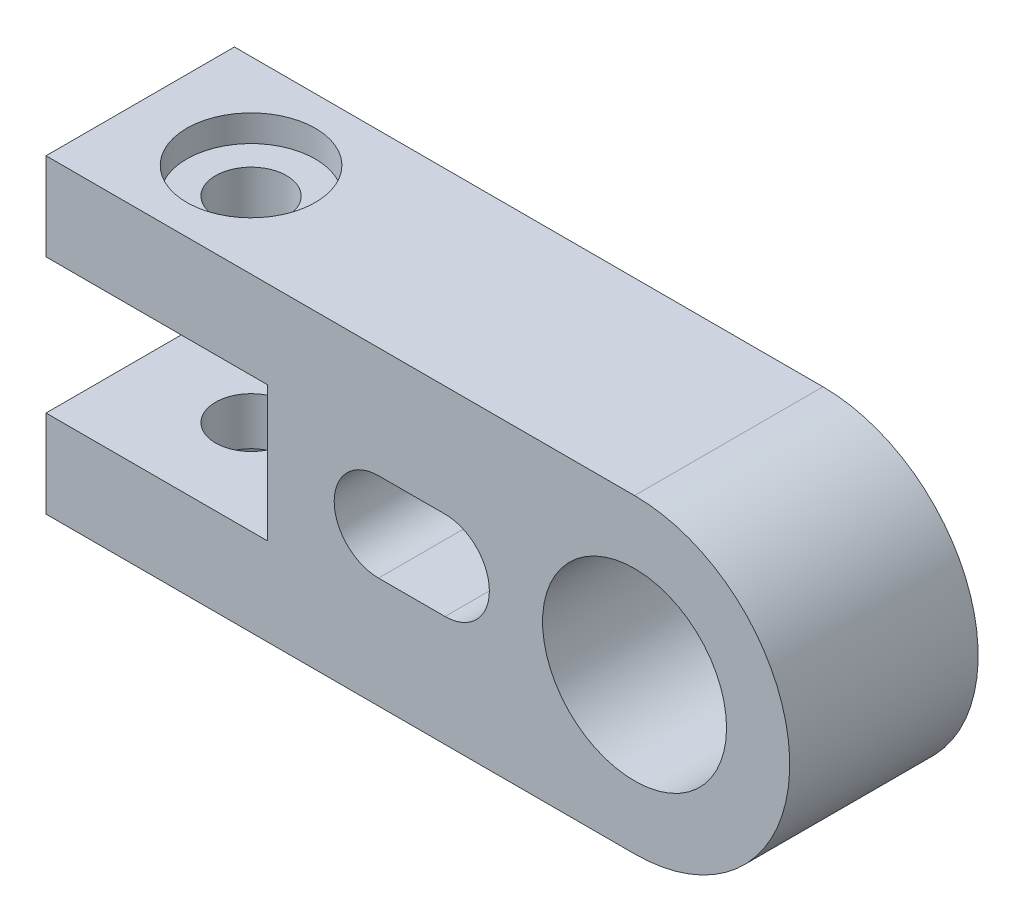
ISO-10303-21;
HEADER;
FILE_DESCRIPTION(('STEP AP214'),'2;1');
FILE_NAME('part.step','',(''),(''),'','','');
FILE_SCHEMA(('AUTOMOTIVE_DESIGN { 1 0 10303 214 1 1 1 1 }'));
ENDSEC;
DATA;
#1=APPLICATION_CONTEXT('core data for automotive mechanical design processes');
#2=APPLICATION_PROTOCOL_DEFINITION('international standard','automotive_design',2000,#1);
#3=PRODUCT_CONTEXT('',#1,'mechanical');
#4=PRODUCT('Part','Part','',(#3));
#5=PRODUCT_RELATED_PRODUCT_CATEGORY('part','',(#4));
#6=PRODUCT_DEFINITION_FORMATION('','',#4);
#7=PRODUCT_DEFINITION_CONTEXT('part definition',#1,'design');
#8=PRODUCT_DEFINITION('design','',#6,#7);
#9=PRODUCT_DEFINITION_SHAPE('','',#8);
#10=(LENGTH_UNIT() NAMED_UNIT(*) SI_UNIT(.MILLI.,.METRE.));
#11=(NAMED_UNIT(*) PLANE_ANGLE_UNIT() SI_UNIT($,.RADIAN.));
#12=(NAMED_UNIT(*) SI_UNIT($,.STERADIAN.) SOLID_ANGLE_UNIT());
#13=UNCERTAINTY_MEASURE_WITH_UNIT(LENGTH_MEASURE(1.E-05),#10,'distance_accuracy_value','');
#14=(GEOMETRIC_REPRESENTATION_CONTEXT(3) GLOBAL_UNCERTAINTY_ASSIGNED_CONTEXT((#13)) GLOBAL_UNIT_ASSIGNED_CONTEXT((#10,
#11,#12)) REPRESENTATION_CONTEXT('',''));
#15=CARTESIAN_POINT('',(0.,0.,0.));
#16=DIRECTION('',(0.,0.,1.));
#17=DIRECTION('',(1.,0.,0.));
#18=AXIS2_PLACEMENT_3D('',#15,#16,#17);
#19=CARTESIAN_POINT('',(0.,-5.2,0.));
#20=DIRECTION('',(0.,-1.,0.));
#21=DIRECTION('',(0.,0.,-1.));
#22=AXIS2_PLACEMENT_3D('',#19,#20,#21);
#23=PLANE('',#22);
#24=CARTESIAN_POINT('',(-21.55,-5.2,4.25));
#25=DIRECTION('',(0.,-1.,0.));
#26=DIRECTION('',(1.,0.,0.));
#27=AXIS2_PLACEMENT_3D('',#24,#25,#26);
#28=CIRCLE('',#27,1.6);
#29=CARTESIAN_POINT('',(-19.95,-5.2,4.25));
#30=VERTEX_POINT('',#29);
#31=EDGE_CURVE('E19',#30,#30,#28,.F.);
#32=ORIENTED_EDGE('',*,*,#31,.T.);
#33=EDGE_LOOP('',(#32));
#34=FACE_BOUND('',#33,.T.);
#35=DIRECTION('',(-0.5,0.,0.866025403784439));
#36=VECTOR('',#35,1.);
#37=CARTESIAN_POINT('',(-24.8986315612998,-5.2,4.25));
#38=LINE('',#37,#36);
#39=CARTESIAN_POINT('',(-24.8986315612998,-5.2,4.25));
#40=VERTEX_POINT('',#39);
#41=CARTESIAN_POINT('',(-23.2243157806499,-5.2,1.35));
#42=VERTEX_POINT('',#41);
#43=EDGE_CURVE('E212',#40,#42,#38,.F.);
#44=ORIENTED_EDGE('',*,*,#43,.T.);
#45=DIRECTION('',(-1.,0.,0.));
#46=VECTOR('',#45,1.);
#47=CARTESIAN_POINT('',(-23.2243157806499,-5.2,1.35));
#48=LINE('',#47,#46);
#49=CARTESIAN_POINT('',(-19.8756842193501,-5.2,1.35));
#50=VERTEX_POINT('',#49);
#51=EDGE_CURVE('E207',#42,#50,#48,.F.);
#52=ORIENTED_EDGE('',*,*,#51,.T.);
#53=DIRECTION('',(-0.5,0.,-0.866025403784439));
#54=VECTOR('',#53,1.);
#55=CARTESIAN_POINT('',(-19.8756842193501,-5.2,1.35));
#56=LINE('',#55,#54);
#57=CARTESIAN_POINT('',(-18.2013684387002,-5.2,4.25));
#58=VERTEX_POINT('',#57);
#59=EDGE_CURVE('E202',#50,#58,#56,.F.);
#60=ORIENTED_EDGE('',*,*,#59,.T.);
#61=DIRECTION('',(0.5,0.,-0.866025403784439));
#62=VECTOR('',#61,1.);
#63=CARTESIAN_POINT('',(-18.2013684387002,-5.2,4.25));
#64=LINE('',#63,#62);
#65=CARTESIAN_POINT('',(-19.8756842193501,-5.2,7.15));
#66=VERTEX_POINT('',#65);
#67=EDGE_CURVE('E197',#58,#66,#64,.F.);
#68=ORIENTED_EDGE('',*,*,#67,.T.);
#69=DIRECTION('',(1.,0.,0.));
#70=VECTOR('',#69,1.);
#71=CARTESIAN_POINT('',(-19.8756842193501,-5.2,7.15));
#72=LINE('',#71,#70);
#73=CARTESIAN_POINT('',(-23.2243157806499,-5.2,7.15));
#74=VERTEX_POINT('',#73);
#75=EDGE_CURVE('E222',#66,#74,#72,.F.);
#76=ORIENTED_EDGE('',*,*,#75,.T.);
#77=DIRECTION('',(0.5,0.,0.866025403784439));
#78=VECTOR('',#77,1.);
#79=CARTESIAN_POINT('',(-23.2243157806499,-5.2,7.15));
#80=LINE('',#79,#78);
#81=EDGE_CURVE('E217',#74,#40,#80,.F.);
#82=ORIENTED_EDGE('',*,*,#81,.T.);
#83=EDGE_LOOP('',(#44,#52,#60,#68,#76,#82));
#84=FACE_BOUND('',#83,.T.);
#85=ADVANCED_FACE('F16',(#34,#84),#23,.T.);
#86=CARTESIAN_POINT('',(-21.55,5.8,4.25));
#87=DIRECTION('',(0.,1.,0.));
#88=DIRECTION('',(-1.,0.,0.));
#89=AXIS2_PLACEMENT_3D('',#86,#87,#88);
#90=PLANE('',#89);
#91=CARTESIAN_POINT('',(-21.55,5.8,4.25));
#92=DIRECTION('',(0.,-1.,0.));
#93=DIRECTION('',(1.,0.,0.));
#94=AXIS2_PLACEMENT_3D('',#91,#92,#93);
#95=CIRCLE('',#94,1.6);
#96=CARTESIAN_POINT('',(-19.95,5.8,4.25));
#97=VERTEX_POINT('',#96);
#98=EDGE_CURVE('E258',#97,#97,#95,.T.);
#99=ORIENTED_EDGE('',*,*,#98,.T.);
#100=EDGE_LOOP('',(#99));
#101=FACE_BOUND('',#100,.T.);
#102=CARTESIAN_POINT('',(-21.55,5.8,4.25));
#103=DIRECTION('',(0.,1.,0.));
#104=DIRECTION('',(-1.,0.,0.));
#105=AXIS2_PLACEMENT_3D('',#102,#103,#104);
#106=CIRCLE('',#105,2.9);
#107=CARTESIAN_POINT('',(-24.45,5.8,4.25));
#108=VERTEX_POINT('',#107);
#109=EDGE_CURVE('E256',#108,#108,#106,.T.);
#110=ORIENTED_EDGE('',*,*,#109,.T.);
#111=EDGE_LOOP('',(#110));
#112=FACE_BOUND('',#111,.T.);
#113=ADVANCED_FACE('F355',(#101,#112),#90,.T.);
#114=CARTESIAN_POINT('',(0.,0.,1.7));
#115=DIRECTION('',(0.,0.,1.));
#116=DIRECTION('',(1.,0.,0.));
#117=AXIS2_PLACEMENT_3D('',#114,#115,#116);
#118=CYLINDRICAL_SURFACE('',#117,4.15);
#119=CARTESIAN_POINT('',(0.,0.,8.5));
#120=DIRECTION('',(0.,0.,1.));
#121=DIRECTION('',(1.,0.,0.));
#122=AXIS2_PLACEMENT_3D('',#119,#120,#121);
#123=CIRCLE('',#122,4.15);
#124=CARTESIAN_POINT('',(4.15,0.,8.5));
#125=VERTEX_POINT('',#124);
#126=EDGE_CURVE('E253',#125,#125,#123,.T.);
#127=ORIENTED_EDGE('',*,*,#126,.T.);
#128=EDGE_LOOP('',(#127));
#129=FACE_BOUND('',#128,.T.);
#130=CARTESIAN_POINT('',(0.,0.,1.7));
#131=DIRECTION('',(0.,0.,1.));
#132=DIRECTION('',(1.,0.,0.));
#133=AXIS2_PLACEMENT_3D('',#130,#131,#132);
#134=CIRCLE('',#133,4.15);
#135=CARTESIAN_POINT('',(4.15,0.,1.7));
#136=VERTEX_POINT('',#135);
#137=EDGE_CURVE('E145',#136,#136,#134,.T.);
#138=ORIENTED_EDGE('',*,*,#137,.F.);
#139=EDGE_LOOP('',(#138));
#140=FACE_BOUND('',#139,.T.);
#141=ADVANCED_FACE('F357',(#129,#140),#118,.F.);
#142=CARTESIAN_POINT('',(-19.8756842193501,-5.2,7.15));
#143=DIRECTION('',(0.,0.,1.));
#144=DIRECTION('',(1.,0.,0.));
#145=AXIS2_PLACEMENT_3D('',#142,#143,#144);
#146=PLANE('',#145);
#147=DIRECTION('',(0.,1.,0.));
#148=VECTOR('',#147,1.);
#149=CARTESIAN_POINT('',(-23.2243157806499,-5.2,7.15));
#150=LINE('',#149,#148);
#151=CARTESIAN_POINT('',(-23.2243157806499,-7.,7.15));
#152=VERTEX_POINT('',#151);
#153=EDGE_CURVE('E219',#152,#74,#150,.T.);
#154=ORIENTED_EDGE('',*,*,#153,.T.);
#155=ORIENTED_EDGE('',*,*,#75,.F.);
#156=DIRECTION('',(0.,1.,0.));
#157=VECTOR('',#156,1.);
#158=CARTESIAN_POINT('',(-19.8756842193501,-5.2,7.15));
#159=LINE('',#158,#157);
#160=CARTESIAN_POINT('',(-19.8756842193501,-7.,7.15));
#161=VERTEX_POINT('',#160);
#162=EDGE_CURVE('E194',#66,#161,#159,.F.);
#163=ORIENTED_EDGE('',*,*,#162,.T.);
#164=DIRECTION('',(-1.,0.,0.));
#165=VECTOR('',#164,1.);
#166=CARTESIAN_POINT('',(0.,-7.,7.15));
#167=LINE('',#166,#165);
#168=EDGE_CURVE('E249',#161,#152,#167,.T.);
#169=ORIENTED_EDGE('',*,*,#168,.T.);
#170=EDGE_LOOP('',(#154,#155,#163,#169));
#171=FACE_BOUND('',#170,.T.);
#172=ADVANCED_FACE('F362',(#171),#146,.F.);
#173=CARTESIAN_POINT('',(-23.2243157806499,-5.2,7.15));
#174=DIRECTION('',(-0.866025403784439,0.,0.5));
#175=DIRECTION('',(0.5,0.,0.866025403784439));
#176=AXIS2_PLACEMENT_3D('',#173,#174,#175);
#177=PLANE('',#176);
#178=DIRECTION('',(0.,1.,0.));
#179=VECTOR('',#178,1.);
#180=CARTESIAN_POINT('',(-24.8986315612998,-5.2,4.25));
#181=LINE('',#180,#179);
#182=CARTESIAN_POINT('',(-24.8986315612998,-7.,4.25));
#183=VERTEX_POINT('',#182);
#184=EDGE_CURVE('E214',#183,#40,#181,.T.);
#185=ORIENTED_EDGE('',*,*,#184,.T.);
#186=ORIENTED_EDGE('',*,*,#81,.F.);
#187=ORIENTED_EDGE('',*,*,#153,.F.);
#188=DIRECTION('',(-0.5,0.,-0.866025403784439));
#189=VECTOR('',#188,1.);
#190=CARTESIAN_POINT('',(-23.2243157806499,-7.,7.15));
#191=LINE('',#190,#189);
#192=EDGE_CURVE('E422',#152,#183,#191,.T.);
#193=ORIENTED_EDGE('',*,*,#192,.T.);
#194=EDGE_LOOP('',(#185,#186,#187,#193));
#195=FACE_BOUND('',#194,.T.);
#196=ADVANCED_FACE('F368',(#195),#177,.F.);
#197=CARTESIAN_POINT('',(-24.8986315612998,-5.2,4.25));
#198=DIRECTION('',(-0.866025403784439,0.,-0.5));
#199=DIRECTION('',(-0.5,0.,0.866025403784439));
#200=AXIS2_PLACEMENT_3D('',#197,#198,#199);
#201=PLANE('',#200);
#202=DIRECTION('',(0.,1.,0.));
#203=VECTOR('',#202,1.);
#204=CARTESIAN_POINT('',(-23.2243157806499,-5.2,1.35));
#205=LINE('',#204,#203);
#206=CARTESIAN_POINT('',(-23.2243157806499,-7.,1.35));
#207=VERTEX_POINT('',#206);
#208=EDGE_CURVE('E209',#207,#42,#205,.T.);
#209=ORIENTED_EDGE('',*,*,#208,.T.);
#210=ORIENTED_EDGE('',*,*,#43,.F.);
#211=ORIENTED_EDGE('',*,*,#184,.F.);
#212=DIRECTION('',(0.5,0.,-0.866025403784439));
#213=VECTOR('',#212,1.);
#214=CARTESIAN_POINT('',(-24.8986315612998,-7.,4.25));
#215=LINE('',#214,#213);
#216=EDGE_CURVE('E409',#183,#207,#215,.T.);
#217=ORIENTED_EDGE('',*,*,#216,.T.);
#218=EDGE_LOOP('',(#209,#210,#211,#217));
#219=FACE_BOUND('',#218,.T.);
#220=ADVANCED_FACE('F372',(#219),#201,.F.);
#221=CARTESIAN_POINT('',(-23.2243157806499,-5.2,1.35));
#222=DIRECTION('',(0.,0.,-1.));
#223=DIRECTION('',(-1.,0.,0.));
#224=AXIS2_PLACEMENT_3D('',#221,#222,#223);
#225=PLANE('',#224);
#226=DIRECTION('',(0.,1.,0.));
#227=VECTOR('',#226,1.);
#228=CARTESIAN_POINT('',(-19.8756842193501,-5.2,1.35));
#229=LINE('',#228,#227);
#230=CARTESIAN_POINT('',(-19.8756842193501,-7.,1.35));
#231=VERTEX_POINT('',#230);
#232=EDGE_CURVE('E204',#231,#50,#229,.T.);
#233=ORIENTED_EDGE('',*,*,#232,.T.);
#234=ORIENTED_EDGE('',*,*,#51,.F.);
#235=ORIENTED_EDGE('',*,*,#208,.F.);
#236=DIRECTION('',(-1.,0.,0.));
#237=VECTOR('',#236,1.);
#238=CARTESIAN_POINT('',(0.,-7.,1.35));
#239=LINE('',#238,#237);
#240=EDGE_CURVE('E413',#207,#231,#239,.F.);
#241=ORIENTED_EDGE('',*,*,#240,.T.);
#242=EDGE_LOOP('',(#233,#234,#235,#241));
#243=FACE_BOUND('',#242,.T.);
#244=ADVANCED_FACE('F376',(#243),#225,.F.);
#245=CARTESIAN_POINT('',(-19.8756842193501,-5.2,1.35));
#246=DIRECTION('',(0.866025403784439,0.,-0.5));
#247=DIRECTION('',(-0.5,0.,-0.866025403784439));
#248=AXIS2_PLACEMENT_3D('',#245,#246,#247);
#249=PLANE('',#248);
#250=DIRECTION('',(0.,1.,0.));
#251=VECTOR('',#250,1.);
#252=CARTESIAN_POINT('',(-18.2013684387002,-5.2,4.25000000000001));
#253=LINE('',#252,#251);
#254=CARTESIAN_POINT('',(-18.2013684387002,-7.,4.25));
#255=VERTEX_POINT('',#254);
#256=EDGE_CURVE('E199',#255,#58,#253,.T.);
#257=ORIENTED_EDGE('',*,*,#256,.T.);
#258=ORIENTED_EDGE('',*,*,#59,.F.);
#259=ORIENTED_EDGE('',*,*,#232,.F.);
#260=DIRECTION('',(0.499999999999999,0.,0.866025403784439));
#261=VECTOR('',#260,1.);
#262=CARTESIAN_POINT('',(-19.8756842193501,-7.,1.35));
#263=LINE('',#262,#261);
#264=EDGE_CURVE('E391',#231,#255,#263,.T.);
#265=ORIENTED_EDGE('',*,*,#264,.T.);
#266=EDGE_LOOP('',(#257,#258,#259,#265));
#267=FACE_BOUND('',#266,.T.);
#268=ADVANCED_FACE('F281',(#267),#249,.F.);
#269=CARTESIAN_POINT('',(-18.2013684387002,-5.2,4.25));
#270=DIRECTION('',(0.866025403784439,0.,0.5));
#271=DIRECTION('',(0.5,0.,-0.866025403784439));
#272=AXIS2_PLACEMENT_3D('',#269,#270,#271);
#273=PLANE('',#272);
#274=ORIENTED_EDGE('',*,*,#162,.F.);
#275=ORIENTED_EDGE('',*,*,#67,.F.);
#276=ORIENTED_EDGE('',*,*,#256,.F.);
#277=DIRECTION('',(-0.499999999999999,0.,0.866025403784439));
#278=VECTOR('',#277,1.);
#279=CARTESIAN_POINT('',(-18.2013684387002,-7.,4.25));
#280=LINE('',#279,#278);
#281=EDGE_CURVE('E191',#255,#161,#280,.T.);
#282=ORIENTED_EDGE('',*,*,#281,.T.);
#283=EDGE_LOOP('',(#274,#275,#276,#282));
#284=FACE_BOUND('',#283,.T.);
#285=ADVANCED_FACE('F270',(#284),#273,.F.);
#286=CARTESIAN_POINT('',(-21.55,11.5254833995939,4.25));
#287=DIRECTION('',(0.,-1.,0.));
#288=DIRECTION('',(1.,0.,0.));
#289=AXIS2_PLACEMENT_3D('',#286,#287,#288);
#290=CYLINDRICAL_SURFACE('',#289,1.6);
#291=CARTESIAN_POINT('',(-21.55,-3.05,4.25));
#292=DIRECTION('',(0.,-1.,0.));
#293=DIRECTION('',(1.,0.,0.));
#294=AXIS2_PLACEMENT_3D('',#291,#292,#293);
#295=CIRCLE('',#294,1.6);
#296=CARTESIAN_POINT('',(-19.95,-3.05,4.25));
#297=VERTEX_POINT('',#296);
#298=EDGE_CURVE('E180',#297,#297,#295,.F.);
#299=ORIENTED_EDGE('',*,*,#298,.T.);
#300=EDGE_LOOP('',(#299));
#301=FACE_BOUND('',#300,.T.);
#302=ORIENTED_EDGE('',*,*,#31,.F.);
#303=EDGE_LOOP('',(#302));
#304=FACE_BOUND('',#303,.T.);
#305=ADVANCED_FACE('F267',(#301,#304),#290,.F.);
#306=CARTESIAN_POINT('',(-21.55,11.5254833995939,4.25));
#307=DIRECTION('',(0.,-1.,0.));
#308=DIRECTION('',(1.,0.,0.));
#309=AXIS2_PLACEMENT_3D('',#306,#307,#308);
#310=CYLINDRICAL_SURFACE('',#309,1.6);
#311=CARTESIAN_POINT('',(-21.55,3.05,4.25));
#312=DIRECTION('',(0.,-1.,0.));
#313=DIRECTION('',(1.,0.,0.));
#314=AXIS2_PLACEMENT_3D('',#311,#312,#313);
#315=CIRCLE('',#314,1.6);
#316=CARTESIAN_POINT('',(-19.95,3.05,4.25));
#317=VERTEX_POINT('',#316);
#318=EDGE_CURVE('E169',#317,#317,#315,.T.);
#319=ORIENTED_EDGE('',*,*,#318,.T.);
#320=EDGE_LOOP('',(#319));
#321=FACE_BOUND('',#320,.T.);
#322=ORIENTED_EDGE('',*,*,#98,.F.);
#323=EDGE_LOOP('',(#322));
#324=FACE_BOUND('',#323,.T.);
#325=ADVANCED_FACE('F269',(#321,#324),#310,.F.);
#326=CARTESIAN_POINT('',(-21.55,5.8,4.25));
#327=DIRECTION('',(0.,1.,0.));
#328=DIRECTION('',(-1.,0.,0.));
#329=AXIS2_PLACEMENT_3D('',#326,#327,#328);
#330=CYLINDRICAL_SURFACE('',#329,2.9);
#331=ORIENTED_EDGE('',*,*,#109,.F.);
#332=EDGE_LOOP('',(#331));
#333=FACE_BOUND('',#332,.T.);
#334=CARTESIAN_POINT('',(-21.55,7.,4.25));
#335=DIRECTION('',(0.,1.,0.));
#336=DIRECTION('',(-1.,0.,0.));
#337=AXIS2_PLACEMENT_3D('',#334,#335,#336);
#338=CIRCLE('',#337,2.9);
#339=CARTESIAN_POINT('',(-24.45,7.,4.25));
#340=VERTEX_POINT('',#339);
#341=EDGE_CURVE('E240',#340,#340,#338,.T.);
#342=ORIENTED_EDGE('',*,*,#341,.T.);
#343=EDGE_LOOP('',(#342));
#344=FACE_BOUND('',#343,.T.);
#345=ADVANCED_FACE('F278',(#333,#344),#330,.F.);
#346=CARTESIAN_POINT('',(0.,0.,8.5));
#347=DIRECTION('',(0.,0.,-1.));
#348=DIRECTION('',(-1.,0.,0.));
#349=AXIS2_PLACEMENT_3D('',#346,#347,#348);
#350=PLANE('',#349);
#351=DIRECTION('',(1.,0.,0.));
#352=VECTOR('',#351,1.);
#353=CARTESIAN_POINT('',(0.,7.,8.5));
#354=LINE('',#353,#352);
#355=CARTESIAN_POINT('',(0.,7.,8.5));
#356=VERTEX_POINT('',#355);
#357=CARTESIAN_POINT('',(-26.55,7.,8.5));
#358=VERTEX_POINT('',#357);
#359=EDGE_CURVE('E162',#356,#358,#354,.F.);
#360=ORIENTED_EDGE('',*,*,#359,.T.);
#361=DIRECTION('',(0.,1.,0.));
#362=VECTOR('',#361,1.);
#363=CARTESIAN_POINT('',(-26.55,7.,8.5));
#364=LINE('',#363,#362);
#365=CARTESIAN_POINT('',(-26.55,3.05,8.5));
#366=VERTEX_POINT('',#365);
#367=EDGE_CURVE('E156',#358,#366,#364,.F.);
#368=ORIENTED_EDGE('',*,*,#367,.T.);
#369=DIRECTION('',(1.,0.,0.));
#370=VECTOR('',#369,1.);
#371=CARTESIAN_POINT('',(-26.55,3.05,8.5));
#372=LINE('',#371,#370);
#373=CARTESIAN_POINT('',(-16.55,3.05,8.5));
#374=VERTEX_POINT('',#373);
#375=EDGE_CURVE('E167',#366,#374,#372,.T.);
#376=ORIENTED_EDGE('',*,*,#375,.T.);
#377=DIRECTION('',(0.,1.,0.));
#378=VECTOR('',#377,1.);
#379=CARTESIAN_POINT('',(-16.55,3.05,8.5));
#380=LINE('',#379,#378);
#381=CARTESIAN_POINT('',(-16.55,-3.05,8.5));
#382=VERTEX_POINT('',#381);
#383=EDGE_CURVE('E172',#374,#382,#380,.F.);
#384=ORIENTED_EDGE('',*,*,#383,.T.);
#385=DIRECTION('',(1.,0.,0.));
#386=VECTOR('',#385,1.);
#387=CARTESIAN_POINT('',(-16.55,-3.05,8.5));
#388=LINE('',#387,#386);
#389=CARTESIAN_POINT('',(-26.55,-3.05,8.5));
#390=VERTEX_POINT('',#389);
#391=EDGE_CURVE('E178',#382,#390,#388,.F.);
#392=ORIENTED_EDGE('',*,*,#391,.T.);
#393=DIRECTION('',(0.,1.,0.));
#394=VECTOR('',#393,1.);
#395=CARTESIAN_POINT('',(-26.55,-3.05,8.5));
#396=LINE('',#395,#394);
#397=CARTESIAN_POINT('',(-26.55,-7.,8.5));
#398=VERTEX_POINT('',#397);
#399=EDGE_CURVE('E183',#390,#398,#396,.F.);
#400=ORIENTED_EDGE('',*,*,#399,.T.);
#401=DIRECTION('',(-1.,0.,0.));
#402=VECTOR('',#401,1.);
#403=CARTESIAN_POINT('',(0.,-7.,8.5));
#404=LINE('',#403,#402);
#405=CARTESIAN_POINT('',(0.,-7.,8.5));
#406=VERTEX_POINT('',#405);
#407=EDGE_CURVE('E189',#398,#406,#404,.F.);
#408=ORIENTED_EDGE('',*,*,#407,.T.);
#409=CARTESIAN_POINT('',(0.,0.,8.5));
#410=DIRECTION('',(0.,0.,-1.));
#411=DIRECTION('',(-1.,0.,0.));
#412=AXIS2_PLACEMENT_3D('',#409,#410,#411);
#413=CIRCLE('',#412,7.);
#414=EDGE_CURVE('E247',#356,#406,#413,.T.);
#415=ORIENTED_EDGE('',*,*,#414,.F.);
#416=EDGE_LOOP('',(#360,#368,#376,#384,#392,#400,#408,#415));
#417=FACE_BOUND('',#416,.T.);
#418=ORIENTED_EDGE('',*,*,#126,.F.);
#419=EDGE_LOOP('',(#418));
#420=FACE_BOUND('',#419,.T.);
#421=CARTESIAN_POINT('',(-8.55,0.,8.5));
#422=DIRECTION('',(0.,0.,1.));
#423=DIRECTION('',(1.,0.,0.));
#424=AXIS2_PLACEMENT_3D('',#421,#422,#423);
#425=CIRCLE('',#424,2.);
#426=CARTESIAN_POINT('',(-8.55,2.,8.5));
#427=VERTEX_POINT('',#426);
#428=CARTESIAN_POINT('',(-8.55,-2.,8.5));
#429=VERTEX_POINT('',#428);
#430=EDGE_CURVE('E129',#427,#429,#425,.F.);
#431=ORIENTED_EDGE('',*,*,#430,.T.);
#432=DIRECTION('',(1.,0.,0.));
#433=VECTOR('',#432,1.);
#434=CARTESIAN_POINT('',(-8.55,-2.,8.5));
#435=LINE('',#434,#433);
#436=CARTESIAN_POINT('',(-11.55,-2.,8.5));
#437=VERTEX_POINT('',#436);
#438=EDGE_CURVE('E224',#429,#437,#435,.F.);
#439=ORIENTED_EDGE('',*,*,#438,.T.);
#440=CARTESIAN_POINT('',(-11.55,0.,8.5));
#441=DIRECTION('',(0.,0.,1.));
#442=DIRECTION('',(1.,0.,0.));
#443=AXIS2_PLACEMENT_3D('',#440,#441,#442);
#444=CIRCLE('',#443,2.);
#445=CARTESIAN_POINT('',(-11.55,2.,8.5));
#446=VERTEX_POINT('',#445);
#447=EDGE_CURVE('E132',#437,#446,#444,.F.);
#448=ORIENTED_EDGE('',*,*,#447,.T.);
#449=DIRECTION('',(-1.,0.,0.));
#450=VECTOR('',#449,1.);
#451=CARTESIAN_POINT('',(-8.55,2.,8.5));
#452=LINE('',#451,#450);
#453=EDGE_CURVE('E126',#446,#427,#452,.F.);
#454=ORIENTED_EDGE('',*,*,#453,.T.);
#455=EDGE_LOOP('',(#431,#439,#448,#454));
#456=FACE_BOUND('',#455,.T.);
#457=ADVANCED_FACE('F128',(#417,#420,#456),#350,.F.);
#458=CARTESIAN_POINT('',(0.,0.,1.7));
#459=DIRECTION('',(0.,0.,1.));
#460=DIRECTION('',(1.,0.,0.));
#461=AXIS2_PLACEMENT_3D('',#458,#459,#460);
#462=PLANE('',#461);
#463=ORIENTED_EDGE('',*,*,#137,.T.);
#464=EDGE_LOOP('',(#463));
#465=FACE_BOUND('',#464,.T.);
#466=CARTESIAN_POINT('',(0.,0.,1.7));
#467=DIRECTION('',(0.,0.,-1.));
#468=DIRECTION('',(-1.,0.,0.));
#469=AXIS2_PLACEMENT_3D('',#466,#467,#468);
#470=CIRCLE('',#469,2.85);
#471=CARTESIAN_POINT('',(-2.85,0.,1.7));
#472=VERTEX_POINT('',#471);
#473=EDGE_CURVE('E237',#472,#472,#470,.T.);
#474=ORIENTED_EDGE('',*,*,#473,.T.);
#475=EDGE_LOOP('',(#474));
#476=FACE_BOUND('',#475,.T.);
#477=ADVANCED_FACE('F339',(#465,#476),#462,.T.);
#478=CARTESIAN_POINT('',(-8.55,0.,-0.000999999999999265));
#479=DIRECTION('',(0.,0.,1.));
#480=DIRECTION('',(1.,0.,0.));
#481=AXIS2_PLACEMENT_3D('',#478,#479,#480);
#482=CYLINDRICAL_SURFACE('',#481,2.);
#483=DIRECTION('',(0.,0.,1.));
#484=VECTOR('',#483,1.);
#485=CARTESIAN_POINT('',(-8.55,2.,-0.000999999999999265));
#486=LINE('',#485,#484);
#487=CARTESIAN_POINT('',(-8.55,2.,0.));
#488=VERTEX_POINT('',#487);
#489=EDGE_CURVE('E136',#427,#488,#486,.F.);
#490=ORIENTED_EDGE('',*,*,#489,.T.);
#491=CARTESIAN_POINT('',(-8.55,0.,0.));
#492=DIRECTION('',(0.,0.,1.));
#493=DIRECTION('',(1.,0.,0.));
#494=AXIS2_PLACEMENT_3D('',#491,#492,#493);
#495=CIRCLE('',#494,2.);
#496=CARTESIAN_POINT('',(-8.55,-2.,0.));
#497=VERTEX_POINT('',#496);
#498=EDGE_CURVE('E235',#497,#488,#495,.T.);
#499=ORIENTED_EDGE('',*,*,#498,.F.);
#500=DIRECTION('',(0.,0.,1.));
#501=VECTOR('',#500,1.);
#502=CARTESIAN_POINT('',(-8.55,-2.,-0.000999999999999265));
#503=LINE('',#502,#501);
#504=EDGE_CURVE('E143',#497,#429,#503,.T.);
#505=ORIENTED_EDGE('',*,*,#504,.T.);
#506=ORIENTED_EDGE('',*,*,#430,.F.);
#507=EDGE_LOOP('',(#490,#499,#505,#506));
#508=FACE_BOUND('',#507,.T.);
#509=ADVANCED_FACE('F140',(#508),#482,.F.);
#510=CARTESIAN_POINT('',(-8.55,2.,-0.000999999999999265));
#511=DIRECTION('',(0.,1.,0.));
#512=DIRECTION('',(-1.,0.,0.));
#513=AXIS2_PLACEMENT_3D('',#510,#511,#512);
#514=PLANE('',#513);
#515=ORIENTED_EDGE('',*,*,#453,.F.);
#516=DIRECTION('',(0.,0.,1.));
#517=VECTOR('',#516,1.);
#518=CARTESIAN_POINT('',(-11.55,2.,-0.000999999999999265));
#519=LINE('',#518,#517);
#520=CARTESIAN_POINT('',(-11.55,2.,0.));
#521=VERTEX_POINT('',#520);
#522=EDGE_CURVE('E151',#446,#521,#519,.F.);
#523=ORIENTED_EDGE('',*,*,#522,.T.);
#524=DIRECTION('',(-1.,0.,0.));
#525=VECTOR('',#524,1.);
#526=CARTESIAN_POINT('',(0.,2.,0.));
#527=LINE('',#526,#525);
#528=EDGE_CURVE('E149',#488,#521,#527,.T.);
#529=ORIENTED_EDGE('',*,*,#528,.F.);
#530=ORIENTED_EDGE('',*,*,#489,.F.);
#531=EDGE_LOOP('',(#515,#523,#529,#530));
#532=FACE_BOUND('',#531,.T.);
#533=ADVANCED_FACE('F147',(#532),#514,.F.);
#534=CARTESIAN_POINT('',(-11.55,0.,-0.000999999999999265));
#535=DIRECTION('',(0.,0.,1.));
#536=DIRECTION('',(1.,0.,0.));
#537=AXIS2_PLACEMENT_3D('',#534,#535,#536);
#538=CYLINDRICAL_SURFACE('',#537,2.);
#539=ORIENTED_EDGE('',*,*,#447,.F.);
#540=DIRECTION('',(0.,0.,1.));
#541=VECTOR('',#540,1.);
#542=CARTESIAN_POINT('',(-11.55,-2.,-0.000999999999999265));
#543=LINE('',#542,#541);
#544=CARTESIAN_POINT('',(-11.55,-2.,0.));
#545=VERTEX_POINT('',#544);
#546=EDGE_CURVE('E225',#437,#545,#543,.F.);
#547=ORIENTED_EDGE('',*,*,#546,.T.);
#548=CARTESIAN_POINT('',(-11.55,0.,0.));
#549=DIRECTION('',(0.,0.,1.));
#550=DIRECTION('',(1.,0.,0.));
#551=AXIS2_PLACEMENT_3D('',#548,#549,#550);
#552=CIRCLE('',#551,2.);
#553=EDGE_CURVE('E232',#521,#545,#552,.T.);
#554=ORIENTED_EDGE('',*,*,#553,.F.);
#555=ORIENTED_EDGE('',*,*,#522,.F.);
#556=EDGE_LOOP('',(#539,#547,#554,#555));
#557=FACE_BOUND('',#556,.T.);
#558=ADVANCED_FACE('F330',(#557),#538,.F.);
#559=CARTESIAN_POINT('',(-8.55,-2.,-0.000999999999999265));
#560=DIRECTION('',(0.,-1.,0.));
#561=DIRECTION('',(1.,0.,0.));
#562=AXIS2_PLACEMENT_3D('',#559,#560,#561);
#563=PLANE('',#562);
#564=ORIENTED_EDGE('',*,*,#438,.F.);
#565=ORIENTED_EDGE('',*,*,#504,.F.);
#566=DIRECTION('',(-1.,0.,0.));
#567=VECTOR('',#566,1.);
#568=CARTESIAN_POINT('',(0.,-2.,0.));
#569=LINE('',#568,#567);
#570=EDGE_CURVE('E231',#545,#497,#569,.F.);
#571=ORIENTED_EDGE('',*,*,#570,.F.);
#572=ORIENTED_EDGE('',*,*,#546,.F.);
#573=EDGE_LOOP('',(#564,#565,#571,#572));
#574=FACE_BOUND('',#573,.T.);
#575=ADVANCED_FACE('F326',(#574),#563,.F.);
#576=CARTESIAN_POINT('',(0.,0.,8.5));
#577=DIRECTION('',(0.,0.,-1.));
#578=DIRECTION('',(-1.,0.,0.));
#579=AXIS2_PLACEMENT_3D('',#576,#577,#578);
#580=CYLINDRICAL_SURFACE('',#579,7.);
#581=ORIENTED_EDGE('',*,*,#414,.T.);
#582=DIRECTION('',(0.,0.,1.));
#583=VECTOR('',#582,1.);
#584=CARTESIAN_POINT('',(0.,-7.,8.5));
#585=LINE('',#584,#583);
#586=CARTESIAN_POINT('',(0.,-7.,0.));
#587=VERTEX_POINT('',#586);
#588=EDGE_CURVE('E186',#406,#587,#585,.F.);
#589=ORIENTED_EDGE('',*,*,#588,.T.);
#590=CARTESIAN_POINT('',(0.,0.,0.));
#591=DIRECTION('',(0.,0.,-1.));
#592=DIRECTION('',(-1.,0.,0.));
#593=AXIS2_PLACEMENT_3D('',#590,#591,#592);
#594=CIRCLE('',#593,7.);
#595=CARTESIAN_POINT('',(0.,7.,0.));
#596=VERTEX_POINT('',#595);
#597=EDGE_CURVE('E227',#596,#587,#594,.T.);
#598=ORIENTED_EDGE('',*,*,#597,.F.);
#599=DIRECTION('',(0.,0.,1.));
#600=VECTOR('',#599,1.);
#601=CARTESIAN_POINT('',(0.,7.,8.5));
#602=LINE('',#601,#600);
#603=EDGE_CURVE('E164',#596,#356,#602,.T.);
#604=ORIENTED_EDGE('',*,*,#603,.T.);
#605=EDGE_LOOP('',(#581,#589,#598,#604));
#606=FACE_BOUND('',#605,.T.);
#607=ADVANCED_FACE('F322',(#606),#580,.T.);
#608=CARTESIAN_POINT('',(0.,-7.,8.5));
#609=DIRECTION('',(0.,1.,0.));
#610=DIRECTION('',(-1.,0.,0.));
#611=AXIS2_PLACEMENT_3D('',#608,#609,#610);
#612=PLANE('',#611);
#613=ORIENTED_EDGE('',*,*,#588,.F.);
#614=ORIENTED_EDGE('',*,*,#407,.F.);
#615=DIRECTION('',(0.,0.,-1.));
#616=VECTOR('',#615,1.);
#617=CARTESIAN_POINT('',(-26.55,-7.,8.5));
#618=LINE('',#617,#616);
#619=CARTESIAN_POINT('',(-26.55,-7.,0.));
#620=VERTEX_POINT('',#619);
#621=EDGE_CURVE('E185',#398,#620,#618,.T.);
#622=ORIENTED_EDGE('',*,*,#621,.T.);
#623=DIRECTION('',(-1.,0.,0.));
#624=VECTOR('',#623,1.);
#625=CARTESIAN_POINT('',(0.,-7.,0.));
#626=LINE('',#625,#624);
#627=EDGE_CURVE('E230',#587,#620,#626,.T.);
#628=ORIENTED_EDGE('',*,*,#627,.F.);
#629=EDGE_LOOP('',(#613,#614,#622,#628));
#630=FACE_BOUND('',#629,.T.);
#631=ORIENTED_EDGE('',*,*,#264,.F.);
#632=ORIENTED_EDGE('',*,*,#240,.F.);
#633=ORIENTED_EDGE('',*,*,#216,.F.);
#634=ORIENTED_EDGE('',*,*,#192,.F.);
#635=ORIENTED_EDGE('',*,*,#168,.F.);
#636=ORIENTED_EDGE('',*,*,#281,.F.);
#637=EDGE_LOOP('',(#631,#632,#633,#634,#635,#636));
#638=FACE_BOUND('',#637,.T.);
#639=ADVANCED_FACE('F318',(#630,#638),#612,.F.);
#640=CARTESIAN_POINT('',(-26.55,-3.05,8.5));
#641=DIRECTION('',(1.,0.,0.));
#642=DIRECTION('',(0.,0.,-1.));
#643=AXIS2_PLACEMENT_3D('',#640,#641,#642);
#644=PLANE('',#643);
#645=ORIENTED_EDGE('',*,*,#621,.F.);
#646=ORIENTED_EDGE('',*,*,#399,.F.);
#647=DIRECTION('',(0.,0.,-1.));
#648=VECTOR('',#647,1.);
#649=CARTESIAN_POINT('',(-26.55,-3.05,8.5));
#650=LINE('',#649,#648);
#651=CARTESIAN_POINT('',(-26.55,-3.05,0.));
#652=VERTEX_POINT('',#651);
#653=EDGE_CURVE('E175',#390,#652,#650,.T.);
#654=ORIENTED_EDGE('',*,*,#653,.T.);
#655=DIRECTION('',(0.,1.,0.));
#656=VECTOR('',#655,1.);
#657=CARTESIAN_POINT('',(-26.55,0.,0.));
#658=LINE('',#657,#656);
#659=EDGE_CURVE('E467',#620,#652,#658,.T.);
#660=ORIENTED_EDGE('',*,*,#659,.F.);
#661=EDGE_LOOP('',(#645,#646,#654,#660));
#662=FACE_BOUND('',#661,.T.);
#663=ADVANCED_FACE('F314',(#662),#644,.F.);
#664=CARTESIAN_POINT('',(-16.55,-3.05,8.5));
#665=DIRECTION('',(0.,-1.,0.));
#666=DIRECTION('',(0.,0.,-1.));
#667=AXIS2_PLACEMENT_3D('',#664,#665,#666);
#668=PLANE('',#667);
#669=ORIENTED_EDGE('',*,*,#653,.F.);
#670=ORIENTED_EDGE('',*,*,#391,.F.);
#671=DIRECTION('',(0.,0.,-1.));
#672=VECTOR('',#671,1.);
#673=CARTESIAN_POINT('',(-16.55,-3.05,8.5));
#674=LINE('',#673,#672);
#675=CARTESIAN_POINT('',(-16.55,-3.05,0.));
#676=VERTEX_POINT('',#675);
#677=EDGE_CURVE('E174',#382,#676,#674,.T.);
#678=ORIENTED_EDGE('',*,*,#677,.T.);
#679=DIRECTION('',(-1.,0.,0.));
#680=VECTOR('',#679,1.);
#681=CARTESIAN_POINT('',(0.,-3.05,0.));
#682=LINE('',#681,#680);
#683=EDGE_CURVE('E459',#652,#676,#682,.F.);
#684=ORIENTED_EDGE('',*,*,#683,.F.);
#685=EDGE_LOOP('',(#669,#670,#678,#684));
#686=FACE_BOUND('',#685,.T.);
#687=ORIENTED_EDGE('',*,*,#298,.F.);
#688=EDGE_LOOP('',(#687));
#689=FACE_BOUND('',#688,.T.);
#690=ADVANCED_FACE('F310',(#686,#689),#668,.F.);
#691=CARTESIAN_POINT('',(-16.55,3.05,8.5));
#692=DIRECTION('',(1.,0.,0.));
#693=DIRECTION('',(0.,0.,-1.));
#694=AXIS2_PLACEMENT_3D('',#691,#692,#693);
#695=PLANE('',#694);
#696=ORIENTED_EDGE('',*,*,#677,.F.);
#697=ORIENTED_EDGE('',*,*,#383,.F.);
#698=DIRECTION('',(0.,0.,1.));
#699=VECTOR('',#698,1.);
#700=CARTESIAN_POINT('',(-16.55,3.05,8.5));
#701=LINE('',#700,#699);
#702=CARTESIAN_POINT('',(-16.55,3.05,0.));
#703=VERTEX_POINT('',#702);
#704=EDGE_CURVE('E159',#374,#703,#701,.F.);
#705=ORIENTED_EDGE('',*,*,#704,.T.);
#706=DIRECTION('',(0.,1.,0.));
#707=VECTOR('',#706,1.);
#708=CARTESIAN_POINT('',(-16.55,0.,0.));
#709=LINE('',#708,#707);
#710=EDGE_CURVE('E451',#676,#703,#709,.T.);
#711=ORIENTED_EDGE('',*,*,#710,.F.);
#712=EDGE_LOOP('',(#696,#697,#705,#711));
#713=FACE_BOUND('',#712,.T.);
#714=ADVANCED_FACE('F306',(#713),#695,.F.);
#715=CARTESIAN_POINT('',(-26.55,3.05,8.5));
#716=DIRECTION('',(0.,1.,0.));
#717=DIRECTION('',(0.,0.,1.));
#718=AXIS2_PLACEMENT_3D('',#715,#716,#717);
#719=PLANE('',#718);
#720=ORIENTED_EDGE('',*,*,#704,.F.);
#721=ORIENTED_EDGE('',*,*,#375,.F.);
#722=DIRECTION('',(0.,0.,-1.));
#723=VECTOR('',#722,1.);
#724=CARTESIAN_POINT('',(-26.55,3.05,8.5));
#725=LINE('',#724,#723);
#726=CARTESIAN_POINT('',(-26.55,3.05,0.));
#727=VERTEX_POINT('',#726);
#728=EDGE_CURVE('E158',#366,#727,#725,.T.);
#729=ORIENTED_EDGE('',*,*,#728,.T.);
#730=DIRECTION('',(-1.,0.,0.));
#731=VECTOR('',#730,1.);
#732=CARTESIAN_POINT('',(0.,3.05,0.));
#733=LINE('',#732,#731);
#734=EDGE_CURVE('E443',#703,#727,#733,.T.);
#735=ORIENTED_EDGE('',*,*,#734,.F.);
#736=EDGE_LOOP('',(#720,#721,#729,#735));
#737=FACE_BOUND('',#736,.T.);
#738=ORIENTED_EDGE('',*,*,#318,.F.);
#739=EDGE_LOOP('',(#738));
#740=FACE_BOUND('',#739,.T.);
#741=ADVANCED_FACE('F303',(#737,#740),#719,.F.);
#742=CARTESIAN_POINT('',(-26.55,7.,8.5));
#743=DIRECTION('',(1.,0.,0.));
#744=DIRECTION('',(0.,0.,-1.));
#745=AXIS2_PLACEMENT_3D('',#742,#743,#744);
#746=PLANE('',#745);
#747=ORIENTED_EDGE('',*,*,#728,.F.);
#748=ORIENTED_EDGE('',*,*,#367,.F.);
#749=DIRECTION('',(0.,0.,1.));
#750=VECTOR('',#749,1.);
#751=CARTESIAN_POINT('',(-26.55,7.,8.5));
#752=LINE('',#751,#750);
#753=CARTESIAN_POINT('',(-26.55,7.,0.));
#754=VERTEX_POINT('',#753);
#755=EDGE_CURVE('E34',#358,#754,#752,.F.);
#756=ORIENTED_EDGE('',*,*,#755,.T.);
#757=DIRECTION('',(0.,1.,0.));
#758=VECTOR('',#757,1.);
#759=CARTESIAN_POINT('',(-26.55,0.,0.));
#760=LINE('',#759,#758);
#761=EDGE_CURVE('E440',#727,#754,#760,.T.);
#762=ORIENTED_EDGE('',*,*,#761,.F.);
#763=EDGE_LOOP('',(#747,#748,#756,#762));
#764=FACE_BOUND('',#763,.T.);
#765=ADVANCED_FACE('F299',(#764),#746,.F.);
#766=CARTESIAN_POINT('',(0.,7.,8.5));
#767=DIRECTION('',(0.,-1.,0.));
#768=DIRECTION('',(1.,0.,0.));
#769=AXIS2_PLACEMENT_3D('',#766,#767,#768);
#770=PLANE('',#769);
#771=ORIENTED_EDGE('',*,*,#755,.F.);
#772=ORIENTED_EDGE('',*,*,#359,.F.);
#773=ORIENTED_EDGE('',*,*,#603,.F.);
#774=DIRECTION('',(-1.,0.,0.));
#775=VECTOR('',#774,1.);
#776=CARTESIAN_POINT('',(0.,7.,0.));
#777=LINE('',#776,#775);
#778=EDGE_CURVE('E25',#754,#596,#777,.F.);
#779=ORIENTED_EDGE('',*,*,#778,.F.);
#780=EDGE_LOOP('',(#771,#772,#773,#779));
#781=FACE_BOUND('',#780,.T.);
#782=ORIENTED_EDGE('',*,*,#341,.F.);
#783=EDGE_LOOP('',(#782));
#784=FACE_BOUND('',#783,.T.);
#785=ADVANCED_FACE('F292',(#781,#784),#770,.F.);
#786=CARTESIAN_POINT('',(0.,0.,8.5));
#787=DIRECTION('',(0.,0.,-1.));
#788=DIRECTION('',(-1.,0.,0.));
#789=AXIS2_PLACEMENT_3D('',#786,#787,#788);
#790=CYLINDRICAL_SURFACE('',#789,2.85);
#791=ORIENTED_EDGE('',*,*,#473,.F.);
#792=EDGE_LOOP('',(#791));
#793=FACE_BOUND('',#792,.T.);
#794=CARTESIAN_POINT('',(0.,0.,0.));
#795=DIRECTION('',(0.,0.,-1.));
#796=DIRECTION('',(-1.,0.,0.));
#797=AXIS2_PLACEMENT_3D('',#794,#795,#796);
#798=CIRCLE('',#797,2.85);
#799=CARTESIAN_POINT('',(-2.85,0.,0.));
#800=VERTEX_POINT('',#799);
#801=EDGE_CURVE('E11',#800,#800,#798,.F.);
#802=ORIENTED_EDGE('',*,*,#801,.F.);
#803=EDGE_LOOP('',(#802));
#804=FACE_BOUND('',#803,.T.);
#805=ADVANCED_FACE('F286',(#793,#804),#790,.F.);
#806=CARTESIAN_POINT('',(0.,0.,0.));
#807=DIRECTION('',(0.,0.,-1.));
#808=DIRECTION('',(-1.,0.,0.));
#809=AXIS2_PLACEMENT_3D('',#806,#807,#808);
#810=PLANE('',#809);
#811=ORIENTED_EDGE('',*,*,#801,.T.);
#812=EDGE_LOOP('',(#811));
#813=FACE_BOUND('',#812,.T.);
#814=ORIENTED_EDGE('',*,*,#761,.T.);
#815=ORIENTED_EDGE('',*,*,#778,.T.);
#816=ORIENTED_EDGE('',*,*,#597,.T.);
#817=ORIENTED_EDGE('',*,*,#627,.T.);
#818=ORIENTED_EDGE('',*,*,#659,.T.);
#819=ORIENTED_EDGE('',*,*,#683,.T.);
#820=ORIENTED_EDGE('',*,*,#710,.T.);
#821=ORIENTED_EDGE('',*,*,#734,.T.);
#822=EDGE_LOOP('',(#814,#815,#816,#817,#818,#819,#820,#821));
#823=FACE_BOUND('',#822,.T.);
#824=ORIENTED_EDGE('',*,*,#553,.T.);
#825=ORIENTED_EDGE('',*,*,#570,.T.);
#826=ORIENTED_EDGE('',*,*,#498,.T.);
#827=ORIENTED_EDGE('',*,*,#528,.T.);
#828=EDGE_LOOP('',(#824,#825,#826,#827));
#829=FACE_BOUND('',#828,.T.);
#830=ADVANCED_FACE('F284',(#813,#823,#829),#810,.T.);
#831=CLOSED_SHELL('',(#85,#113,#141,#172,#196,#220,#244,#268,#285,#305,#325,#345,#457,#477,#509,
#533,#558,#575,#607,#639,#663,#690,#714,#741,#765,#785,#805,#830));
#832=MANIFOLD_SOLID_BREP('B1',#831);
#833=ADVANCED_BREP_SHAPE_REPRESENTATION('',(#18,#832),#14);
#834=SHAPE_DEFINITION_REPRESENTATION(#9,#833);
ENDSEC;
END-ISO-10303-21;
